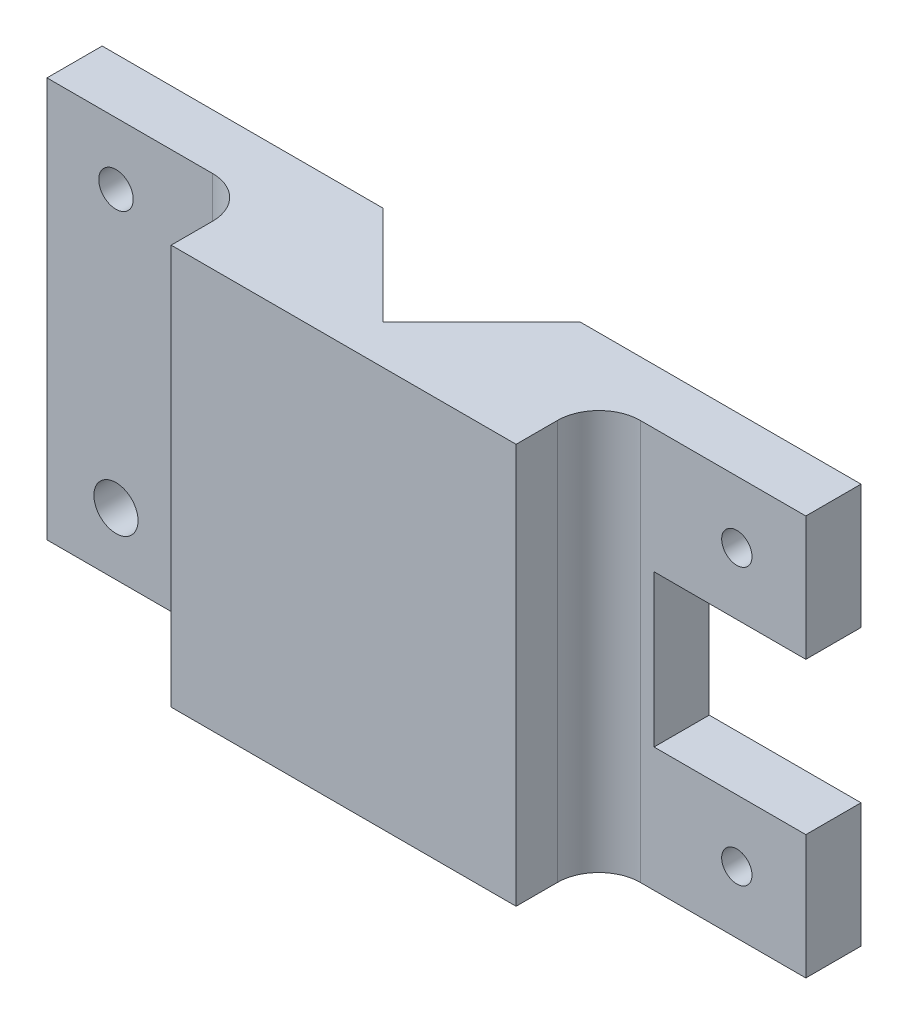
ISO-10303-21;
HEADER;
FILE_DESCRIPTION(('STEP AP214'),'2;1');
FILE_NAME('part.step','',(''),(''),'','','');
FILE_SCHEMA(('AUTOMOTIVE_DESIGN { 1 0 10303 214 1 1 1 1 }'));
ENDSEC;
DATA;
#1=APPLICATION_CONTEXT('core data for automotive mechanical design processes');
#2=APPLICATION_PROTOCOL_DEFINITION('international standard','automotive_design',2000,#1);
#3=PRODUCT_CONTEXT('',#1,'mechanical');
#4=PRODUCT('Part','Part','',(#3));
#5=PRODUCT_RELATED_PRODUCT_CATEGORY('part','',(#4));
#6=PRODUCT_DEFINITION_FORMATION('','',#4);
#7=PRODUCT_DEFINITION_CONTEXT('part definition',#1,'design');
#8=PRODUCT_DEFINITION('design','',#6,#7);
#9=PRODUCT_DEFINITION_SHAPE('','',#8);
#10=(LENGTH_UNIT() NAMED_UNIT(*) SI_UNIT(.MILLI.,.METRE.));
#11=(NAMED_UNIT(*) PLANE_ANGLE_UNIT() SI_UNIT($,.RADIAN.));
#12=(NAMED_UNIT(*) SI_UNIT($,.STERADIAN.) SOLID_ANGLE_UNIT());
#13=UNCERTAINTY_MEASURE_WITH_UNIT(LENGTH_MEASURE(1.E-05),#10,'distance_accuracy_value','');
#14=(GEOMETRIC_REPRESENTATION_CONTEXT(3) GLOBAL_UNCERTAINTY_ASSIGNED_CONTEXT((#13)) GLOBAL_UNIT_ASSIGNED_CONTEXT((#10,
#11,#12)) REPRESENTATION_CONTEXT('',''));
#15=CARTESIAN_POINT('',(0.,0.,0.));
#16=DIRECTION('',(0.,0.,1.));
#17=DIRECTION('',(1.,0.,0.));
#18=AXIS2_PLACEMENT_3D('',#15,#16,#17);
#19=CARTESIAN_POINT('',(27.5,14.5,0.));
#20=DIRECTION('',(-1.,0.,0.));
#21=DIRECTION('',(0.,0.,1.));
#22=AXIS2_PLACEMENT_3D('',#19,#20,#21);
#23=PLANE('',#22);
#24=DIRECTION('',(0.,-1.,0.));
#25=VECTOR('',#24,1.);
#26=CARTESIAN_POINT('',(27.5,14.5,0.));
#27=LINE('',#26,#25);
#28=CARTESIAN_POINT('',(27.5,-5.5,0.));
#29=VERTEX_POINT('',#28);
#30=CARTESIAN_POINT('',(27.5,-14.5,0.));
#31=VERTEX_POINT('',#30);
#32=EDGE_CURVE('E180',#29,#31,#27,.T.);
#33=ORIENTED_EDGE('',*,*,#32,.F.);
#34=DIRECTION('',(0.,0.,1.));
#35=VECTOR('',#34,1.);
#36=CARTESIAN_POINT('',(27.5,-5.5,0.));
#37=LINE('',#36,#35);
#38=CARTESIAN_POINT('',(27.5,-5.5,4.));
#39=VERTEX_POINT('',#38);
#40=EDGE_CURVE('E532',#29,#39,#37,.T.);
#41=ORIENTED_EDGE('',*,*,#40,.T.);
#42=DIRECTION('',(0.,-1.,0.));
#43=VECTOR('',#42,1.);
#44=CARTESIAN_POINT('',(27.5,14.5,4.));
#45=LINE('',#44,#43);
#46=CARTESIAN_POINT('',(27.5,-14.5,4.));
#47=VERTEX_POINT('',#46);
#48=EDGE_CURVE('E179',#39,#47,#45,.T.);
#49=ORIENTED_EDGE('',*,*,#48,.T.);
#50=DIRECTION('',(0.,0.,-1.));
#51=VECTOR('',#50,1.);
#52=CARTESIAN_POINT('',(27.5,-14.5,0.));
#53=LINE('',#52,#51);
#54=EDGE_CURVE('E235',#47,#31,#53,.T.);
#55=ORIENTED_EDGE('',*,*,#54,.T.);
#56=EDGE_LOOP('',(#33,#41,#49,#55));
#57=FACE_BOUND('',#56,.T.);
#58=ADVANCED_FACE('F33',(#57),#23,.F.);
#59=CARTESIAN_POINT('',(-12.5,14.5,4.));
#60=DIRECTION('',(1.,0.,0.));
#61=DIRECTION('',(0.,0.,-1.));
#62=AXIS2_PLACEMENT_3D('',#59,#60,#61);
#63=PLANE('',#62);
#64=DIRECTION('',(0.,0.,1.));
#65=VECTOR('',#64,1.);
#66=CARTESIAN_POINT('',(-12.5,14.5,4.));
#67=LINE('',#66,#65);
#68=CARTESIAN_POINT('',(-12.5,14.5,7.));
#69=VERTEX_POINT('',#68);
#70=CARTESIAN_POINT('',(-12.5,14.5,10.));
#71=VERTEX_POINT('',#70);
#72=EDGE_CURVE('E255',#69,#71,#67,.T.);
#73=ORIENTED_EDGE('',*,*,#72,.F.);
#74=DIRECTION('',(0.,-1.,0.));
#75=VECTOR('',#74,1.);
#76=CARTESIAN_POINT('',(-12.5,-14.5,7.));
#77=LINE('',#76,#75);
#78=CARTESIAN_POINT('',(-12.5,-14.5,7.));
#79=VERTEX_POINT('',#78);
#80=EDGE_CURVE('E199',#69,#79,#77,.T.);
#81=ORIENTED_EDGE('',*,*,#80,.T.);
#82=DIRECTION('',(0.,0.,1.));
#83=VECTOR('',#82,1.);
#84=CARTESIAN_POINT('',(-12.5,-14.5,4.));
#85=LINE('',#84,#83);
#86=CARTESIAN_POINT('',(-12.5,-14.5,10.));
#87=VERTEX_POINT('',#86);
#88=EDGE_CURVE('E237',#79,#87,#85,.T.);
#89=ORIENTED_EDGE('',*,*,#88,.T.);
#90=DIRECTION('',(0.,-1.,0.));
#91=VECTOR('',#90,1.);
#92=CARTESIAN_POINT('',(-12.5,14.5,10.));
#93=LINE('',#92,#91);
#94=EDGE_CURVE('E191',#71,#87,#93,.T.);
#95=ORIENTED_EDGE('',*,*,#94,.F.);
#96=EDGE_LOOP('',(#73,#81,#89,#95));
#97=FACE_BOUND('',#96,.T.);
#98=ADVANCED_FACE('F317',(#97),#63,.F.);
#99=CARTESIAN_POINT('',(12.5,14.5,10.));
#100=DIRECTION('',(0.,0.,-1.));
#101=DIRECTION('',(-1.,0.,0.));
#102=AXIS2_PLACEMENT_3D('',#99,#100,#101);
#103=PLANE('',#102);
#104=DIRECTION('',(1.,0.,0.));
#105=VECTOR('',#104,1.);
#106=CARTESIAN_POINT('',(12.5,-14.5,10.));
#107=LINE('',#106,#105);
#108=CARTESIAN_POINT('',(12.5,-14.5,10.));
#109=VERTEX_POINT('',#108);
#110=EDGE_CURVE('E233',#87,#109,#107,.T.);
#111=ORIENTED_EDGE('',*,*,#110,.T.);
#112=DIRECTION('',(0.,-1.,0.));
#113=VECTOR('',#112,1.);
#114=CARTESIAN_POINT('',(12.5,14.5,10.));
#115=LINE('',#114,#113);
#116=CARTESIAN_POINT('',(12.5,14.5,10.));
#117=VERTEX_POINT('',#116);
#118=EDGE_CURVE('E188',#117,#109,#115,.T.);
#119=ORIENTED_EDGE('',*,*,#118,.F.);
#120=DIRECTION('',(1.,0.,0.));
#121=VECTOR('',#120,1.);
#122=CARTESIAN_POINT('',(12.5,14.5,10.));
#123=LINE('',#122,#121);
#124=EDGE_CURVE('E309',#71,#117,#123,.T.);
#125=ORIENTED_EDGE('',*,*,#124,.F.);
#126=ORIENTED_EDGE('',*,*,#94,.T.);
#127=EDGE_LOOP('',(#111,#119,#125,#126));
#128=FACE_BOUND('',#127,.T.);
#129=ADVANCED_FACE('F316',(#128),#103,.F.);
#130=CARTESIAN_POINT('',(12.5,14.5,4.));
#131=DIRECTION('',(-1.,0.,0.));
#132=DIRECTION('',(0.,0.,1.));
#133=AXIS2_PLACEMENT_3D('',#130,#131,#132);
#134=PLANE('',#133);
#135=DIRECTION('',(0.,0.,-1.));
#136=VECTOR('',#135,1.);
#137=CARTESIAN_POINT('',(12.5,-14.5,4.));
#138=LINE('',#137,#136);
#139=CARTESIAN_POINT('',(12.5,-14.5,7.));
#140=VERTEX_POINT('',#139);
#141=EDGE_CURVE('E227',#109,#140,#138,.T.);
#142=ORIENTED_EDGE('',*,*,#141,.T.);
#143=DIRECTION('',(0.,-1.,0.));
#144=VECTOR('',#143,1.);
#145=CARTESIAN_POINT('',(12.5,14.5,7.));
#146=LINE('',#145,#144);
#147=CARTESIAN_POINT('',(12.5,14.5,7.));
#148=VERTEX_POINT('',#147);
#149=EDGE_CURVE('E197',#140,#148,#146,.F.);
#150=ORIENTED_EDGE('',*,*,#149,.T.);
#151=DIRECTION('',(0.,0.,-1.));
#152=VECTOR('',#151,1.);
#153=CARTESIAN_POINT('',(12.5,14.5,4.));
#154=LINE('',#153,#152);
#155=EDGE_CURVE('E213',#117,#148,#154,.T.);
#156=ORIENTED_EDGE('',*,*,#155,.F.);
#157=ORIENTED_EDGE('',*,*,#118,.T.);
#158=EDGE_LOOP('',(#142,#150,#156,#157));
#159=FACE_BOUND('',#158,.T.);
#160=ADVANCED_FACE('F231',(#159),#134,.F.);
#161=CARTESIAN_POINT('',(27.5,14.5,4.));
#162=DIRECTION('',(0.,0.,-1.));
#163=DIRECTION('',(-1.,0.,0.));
#164=AXIS2_PLACEMENT_3D('',#161,#162,#163);
#165=PLANE('',#164);
#166=CARTESIAN_POINT('',(22.5,-10.,4.));
#167=DIRECTION('',(0.,0.,-1.));
#168=DIRECTION('',(-1.,0.,0.));
#169=AXIS2_PLACEMENT_3D('',#166,#167,#168);
#170=CIRCLE('',#169,1.1);
#171=CARTESIAN_POINT('',(21.4,-10.,4.));
#172=VERTEX_POINT('',#171);
#173=EDGE_CURVE('E295',#172,#172,#170,.T.);
#174=ORIENTED_EDGE('',*,*,#173,.T.);
#175=EDGE_LOOP('',(#174));
#176=FACE_BOUND('',#175,.T.);
#177=CARTESIAN_POINT('',(22.5,10.,4.));
#178=DIRECTION('',(0.,0.,-1.));
#179=DIRECTION('',(-1.,0.,0.));
#180=AXIS2_PLACEMENT_3D('',#177,#178,#179);
#181=CIRCLE('',#180,1.1);
#182=CARTESIAN_POINT('',(21.4,10.,4.));
#183=VERTEX_POINT('',#182);
#184=EDGE_CURVE('E299',#183,#183,#181,.T.);
#185=ORIENTED_EDGE('',*,*,#184,.T.);
#186=EDGE_LOOP('',(#185));
#187=FACE_BOUND('',#186,.T.);
#188=DIRECTION('',(1.,0.,0.));
#189=VECTOR('',#188,1.);
#190=CARTESIAN_POINT('',(27.5,14.5,4.));
#191=LINE('',#190,#189);
#192=CARTESIAN_POINT('',(15.5,14.5,4.));
#193=VERTEX_POINT('',#192);
#194=CARTESIAN_POINT('',(27.5,14.5,4.));
#195=VERTEX_POINT('',#194);
#196=EDGE_CURVE('E211',#193,#195,#191,.T.);
#197=ORIENTED_EDGE('',*,*,#196,.F.);
#198=DIRECTION('',(0.,-1.,0.));
#199=VECTOR('',#198,1.);
#200=CARTESIAN_POINT('',(15.5,-14.5,4.));
#201=LINE('',#200,#199);
#202=CARTESIAN_POINT('',(15.5,-14.5,4.));
#203=VERTEX_POINT('',#202);
#204=EDGE_CURVE('E194',#193,#203,#201,.T.);
#205=ORIENTED_EDGE('',*,*,#204,.T.);
#206=DIRECTION('',(1.,0.,0.));
#207=VECTOR('',#206,1.);
#208=CARTESIAN_POINT('',(27.5,-14.5,4.));
#209=LINE('',#208,#207);
#210=EDGE_CURVE('E229',#203,#47,#209,.T.);
#211=ORIENTED_EDGE('',*,*,#210,.T.);
#212=ORIENTED_EDGE('',*,*,#48,.F.);
#213=DIRECTION('',(-1.,0.,0.));
#214=VECTOR('',#213,1.);
#215=CARTESIAN_POINT('',(27.5,-5.5,4.));
#216=LINE('',#215,#214);
#217=CARTESIAN_POINT('',(16.5,-5.5,4.));
#218=VERTEX_POINT('',#217);
#219=EDGE_CURVE('E304',#39,#218,#216,.T.);
#220=ORIENTED_EDGE('',*,*,#219,.T.);
#221=DIRECTION('',(0.,1.,0.));
#222=VECTOR('',#221,1.);
#223=CARTESIAN_POINT('',(16.5,14.5,4.));
#224=LINE('',#223,#222);
#225=CARTESIAN_POINT('',(16.5,5.5,4.));
#226=VERTEX_POINT('',#225);
#227=EDGE_CURVE('E530',#218,#226,#224,.T.);
#228=ORIENTED_EDGE('',*,*,#227,.T.);
#229=DIRECTION('',(1.,0.,0.));
#230=VECTOR('',#229,1.);
#231=CARTESIAN_POINT('',(27.5,5.5,4.));
#232=LINE('',#231,#230);
#233=CARTESIAN_POINT('',(27.5,5.5,4.));
#234=VERTEX_POINT('',#233);
#235=EDGE_CURVE('E540',#226,#234,#232,.T.);
#236=ORIENTED_EDGE('',*,*,#235,.T.);
#237=EDGE_CURVE('E173',#195,#234,#45,.T.);
#238=ORIENTED_EDGE('',*,*,#237,.F.);
#239=EDGE_LOOP('',(#197,#205,#211,#212,#220,#228,#236,#238));
#240=FACE_BOUND('',#239,.T.);
#241=ADVANCED_FACE('F218',(#176,#187,#240),#165,.F.);
#242=ORIENTED_EDGE('',*,*,#237,.T.);
#243=DIRECTION('',(0.,0.,1.));
#244=VECTOR('',#243,1.);
#245=CARTESIAN_POINT('',(27.5,5.5,0.));
#246=LINE('',#245,#244);
#247=CARTESIAN_POINT('',(27.5,5.5,0.));
#248=VERTEX_POINT('',#247);
#249=EDGE_CURVE('E155',#248,#234,#246,.T.);
#250=ORIENTED_EDGE('',*,*,#249,.F.);
#251=CARTESIAN_POINT('',(27.5,14.5,0.));
#252=VERTEX_POINT('',#251);
#253=EDGE_CURVE('E170',#252,#248,#27,.T.);
#254=ORIENTED_EDGE('',*,*,#253,.F.);
#255=DIRECTION('',(0.,0.,-1.));
#256=VECTOR('',#255,1.);
#257=CARTESIAN_POINT('',(27.5,14.5,0.));
#258=LINE('',#257,#256);
#259=EDGE_CURVE('E220',#195,#252,#258,.T.);
#260=ORIENTED_EDGE('',*,*,#259,.F.);
#261=EDGE_LOOP('',(#242,#250,#254,#260));
#262=FACE_BOUND('',#261,.T.);
#263=ADVANCED_FACE('F168',(#262),#23,.F.);
#264=CARTESIAN_POINT('',(7.1317279836453,14.5,0.));
#265=DIRECTION('',(0.,0.,1.));
#266=DIRECTION('',(1.,0.,0.));
#267=AXIS2_PLACEMENT_3D('',#264,#265,#266);
#268=PLANE('',#267);
#269=CARTESIAN_POINT('',(22.5,-10.,0.));
#270=DIRECTION('',(0.,0.,1.));
#271=DIRECTION('',(1.,0.,0.));
#272=AXIS2_PLACEMENT_3D('',#269,#270,#271);
#273=CIRCLE('',#272,1.1);
#274=CARTESIAN_POINT('',(23.6,-10.,0.));
#275=VERTEX_POINT('',#274);
#276=EDGE_CURVE('E545',#275,#275,#273,.T.);
#277=ORIENTED_EDGE('',*,*,#276,.T.);
#278=EDGE_LOOP('',(#277));
#279=FACE_BOUND('',#278,.T.);
#280=CARTESIAN_POINT('',(22.5,10.,0.));
#281=DIRECTION('',(0.,0.,1.));
#282=DIRECTION('',(1.,0.,0.));
#283=AXIS2_PLACEMENT_3D('',#280,#281,#282);
#284=CIRCLE('',#283,1.1);
#285=CARTESIAN_POINT('',(23.6,10.,0.));
#286=VERTEX_POINT('',#285);
#287=EDGE_CURVE('E163',#286,#286,#284,.T.);
#288=ORIENTED_EDGE('',*,*,#287,.T.);
#289=EDGE_LOOP('',(#288));
#290=FACE_BOUND('',#289,.T.);
#291=DIRECTION('',(0.,-1.,0.));
#292=VECTOR('',#291,1.);
#293=CARTESIAN_POINT('',(16.5,5.5,0.));
#294=LINE('',#293,#292);
#295=CARTESIAN_POINT('',(16.5,5.5,0.));
#296=VERTEX_POINT('',#295);
#297=CARTESIAN_POINT('',(16.5,-5.5,0.));
#298=VERTEX_POINT('',#297);
#299=EDGE_CURVE('E162',#296,#298,#294,.T.);
#300=ORIENTED_EDGE('',*,*,#299,.T.);
#301=DIRECTION('',(1.,0.,0.));
#302=VECTOR('',#301,1.);
#303=CARTESIAN_POINT('',(16.5,-5.5,0.));
#304=LINE('',#303,#302);
#305=EDGE_CURVE('E174',#298,#29,#304,.T.);
#306=ORIENTED_EDGE('',*,*,#305,.T.);
#307=ORIENTED_EDGE('',*,*,#32,.T.);
#308=DIRECTION('',(-1.,0.,0.));
#309=VECTOR('',#308,1.);
#310=CARTESIAN_POINT('',(7.1317279836453,-14.5,0.));
#311=LINE('',#310,#309);
#312=CARTESIAN_POINT('',(7.1317279836453,-14.5,0.));
#313=VERTEX_POINT('',#312);
#314=EDGE_CURVE('E243',#31,#313,#311,.T.);
#315=ORIENTED_EDGE('',*,*,#314,.T.);
#316=DIRECTION('',(0.,-1.,0.));
#317=VECTOR('',#316,1.);
#318=CARTESIAN_POINT('',(7.1317279836453,14.5,0.));
#319=LINE('',#318,#317);
#320=CARTESIAN_POINT('',(7.1317279836453,14.5,0.));
#321=VERTEX_POINT('',#320);
#322=EDGE_CURVE('E184',#321,#313,#319,.T.);
#323=ORIENTED_EDGE('',*,*,#322,.F.);
#324=DIRECTION('',(-1.,0.,0.));
#325=VECTOR('',#324,1.);
#326=CARTESIAN_POINT('',(7.1317279836453,14.5,0.));
#327=LINE('',#326,#325);
#328=EDGE_CURVE('E178',#252,#321,#327,.T.);
#329=ORIENTED_EDGE('',*,*,#328,.F.);
#330=ORIENTED_EDGE('',*,*,#253,.T.);
#331=DIRECTION('',(-1.,0.,0.));
#332=VECTOR('',#331,1.);
#333=CARTESIAN_POINT('',(27.5,5.5,0.));
#334=LINE('',#333,#332);
#335=EDGE_CURVE('E152',#248,#296,#334,.T.);
#336=ORIENTED_EDGE('',*,*,#335,.T.);
#337=EDGE_LOOP('',(#300,#306,#307,#315,#323,#329,#330,#336));
#338=FACE_BOUND('',#337,.T.);
#339=ADVANCED_FACE('F176',(#279,#290,#338),#268,.F.);
#340=CARTESIAN_POINT('',(0.,14.5,7.1317279836453));
#341=DIRECTION('',(0.707106781186547,0.,0.707106781186548));
#342=DIRECTION('',(0.707106781186548,0.,-0.707106781186547));
#343=AXIS2_PLACEMENT_3D('',#340,#341,#342);
#344=PLANE('',#343);
#345=DIRECTION('',(-0.707106781186548,0.,0.707106781186547));
#346=VECTOR('',#345,1.);
#347=CARTESIAN_POINT('',(0.,-14.5,7.1317279836453));
#348=LINE('',#347,#346);
#349=CARTESIAN_POINT('',(0.,-14.5,7.1317279836453));
#350=VERTEX_POINT('',#349);
#351=EDGE_CURVE('E245',#313,#350,#348,.T.);
#352=ORIENTED_EDGE('',*,*,#351,.T.);
#353=DIRECTION('',(0.,-1.,0.));
#354=VECTOR('',#353,1.);
#355=CARTESIAN_POINT('',(0.,14.5,7.1317279836453));
#356=LINE('',#355,#354);
#357=CARTESIAN_POINT('',(0.,14.5,7.1317279836453));
#358=VERTEX_POINT('',#357);
#359=EDGE_CURVE('E265',#358,#350,#356,.T.);
#360=ORIENTED_EDGE('',*,*,#359,.F.);
#361=DIRECTION('',(-0.707106781186548,0.,0.707106781186547));
#362=VECTOR('',#361,1.);
#363=CARTESIAN_POINT('',(0.,14.5,7.1317279836453));
#364=LINE('',#363,#362);
#365=EDGE_CURVE('E276',#321,#358,#364,.T.);
#366=ORIENTED_EDGE('',*,*,#365,.F.);
#367=ORIENTED_EDGE('',*,*,#322,.T.);
#368=EDGE_LOOP('',(#352,#360,#366,#367));
#369=FACE_BOUND('',#368,.T.);
#370=ADVANCED_FACE('F275',(#369),#344,.F.);
#371=CARTESIAN_POINT('',(-7.1317279836453,14.5,0.));
#372=DIRECTION('',(-0.707106781186547,0.,0.707106781186548));
#373=DIRECTION('',(0.707106781186548,0.,0.707106781186547));
#374=AXIS2_PLACEMENT_3D('',#371,#372,#373);
#375=PLANE('',#374);
#376=DIRECTION('',(-0.707106781186548,0.,-0.707106781186547));
#377=VECTOR('',#376,1.);
#378=CARTESIAN_POINT('',(-7.1317279836453,-14.5,0.));
#379=LINE('',#378,#377);
#380=CARTESIAN_POINT('',(-7.1317279836453,-14.5,0.));
#381=VERTEX_POINT('',#380);
#382=EDGE_CURVE('E247',#350,#381,#379,.T.);
#383=ORIENTED_EDGE('',*,*,#382,.T.);
#384=DIRECTION('',(0.,-1.,0.));
#385=VECTOR('',#384,1.);
#386=CARTESIAN_POINT('',(-7.1317279836453,14.5,0.));
#387=LINE('',#386,#385);
#388=CARTESIAN_POINT('',(-7.1317279836453,14.5,0.));
#389=VERTEX_POINT('',#388);
#390=EDGE_CURVE('E263',#389,#381,#387,.T.);
#391=ORIENTED_EDGE('',*,*,#390,.F.);
#392=DIRECTION('',(-0.707106781186548,0.,-0.707106781186547));
#393=VECTOR('',#392,1.);
#394=CARTESIAN_POINT('',(-7.1317279836453,14.5,0.));
#395=LINE('',#394,#393);
#396=EDGE_CURVE('E289',#358,#389,#395,.T.);
#397=ORIENTED_EDGE('',*,*,#396,.F.);
#398=ORIENTED_EDGE('',*,*,#359,.T.);
#399=EDGE_LOOP('',(#383,#391,#397,#398));
#400=FACE_BOUND('',#399,.T.);
#401=ADVANCED_FACE('F281',(#400),#375,.F.);
#402=CARTESIAN_POINT('',(-7.1317279836453,14.5,0.));
#403=DIRECTION('',(0.,0.,1.));
#404=DIRECTION('',(1.,0.,0.));
#405=AXIS2_PLACEMENT_3D('',#402,#403,#404);
#406=PLANE('',#405);
#407=CARTESIAN_POINT('',(-22.5,10.,0.));
#408=DIRECTION('',(0.,0.,1.));
#409=DIRECTION('',(1.,0.,0.));
#410=AXIS2_PLACEMENT_3D('',#407,#408,#409);
#411=CIRCLE('',#410,1.25);
#412=CARTESIAN_POINT('',(-21.25,10.,0.));
#413=VERTEX_POINT('',#412);
#414=EDGE_CURVE('E548',#413,#413,#411,.T.);
#415=ORIENTED_EDGE('',*,*,#414,.T.);
#416=EDGE_LOOP('',(#415));
#417=FACE_BOUND('',#416,.T.);
#418=CARTESIAN_POINT('',(-22.5,-10.,0.));
#419=DIRECTION('',(0.,0.,1.));
#420=DIRECTION('',(1.,0.,0.));
#421=AXIS2_PLACEMENT_3D('',#418,#419,#420);
#422=CIRCLE('',#421,1.6);
#423=CARTESIAN_POINT('',(-20.9,-10.,0.));
#424=VERTEX_POINT('',#423);
#425=EDGE_CURVE('E554',#424,#424,#422,.T.);
#426=ORIENTED_EDGE('',*,*,#425,.T.);
#427=EDGE_LOOP('',(#426));
#428=FACE_BOUND('',#427,.T.);
#429=DIRECTION('',(-1.,0.,0.));
#430=VECTOR('',#429,1.);
#431=CARTESIAN_POINT('',(-7.1317279836453,-14.5,0.));
#432=LINE('',#431,#430);
#433=CARTESIAN_POINT('',(-27.5,-14.5,0.));
#434=VERTEX_POINT('',#433);
#435=EDGE_CURVE('E249',#381,#434,#432,.T.);
#436=ORIENTED_EDGE('',*,*,#435,.T.);
#437=DIRECTION('',(0.,-1.,0.));
#438=VECTOR('',#437,1.);
#439=CARTESIAN_POINT('',(-27.5,14.5,0.));
#440=LINE('',#439,#438);
#441=CARTESIAN_POINT('',(-27.5,14.5,0.));
#442=VERTEX_POINT('',#441);
#443=EDGE_CURVE('E259',#442,#434,#440,.T.);
#444=ORIENTED_EDGE('',*,*,#443,.F.);
#445=DIRECTION('',(-1.,0.,0.));
#446=VECTOR('',#445,1.);
#447=CARTESIAN_POINT('',(-7.1317279836453,14.5,0.));
#448=LINE('',#447,#446);
#449=EDGE_CURVE('E286',#389,#442,#448,.T.);
#450=ORIENTED_EDGE('',*,*,#449,.F.);
#451=ORIENTED_EDGE('',*,*,#390,.T.);
#452=EDGE_LOOP('',(#436,#444,#450,#451));
#453=FACE_BOUND('',#452,.T.);
#454=ADVANCED_FACE('F284',(#417,#428,#453),#406,.F.);
#455=CARTESIAN_POINT('',(-27.5,14.5,0.));
#456=DIRECTION('',(1.,0.,0.));
#457=DIRECTION('',(0.,0.,-1.));
#458=AXIS2_PLACEMENT_3D('',#455,#456,#457);
#459=PLANE('',#458);
#460=DIRECTION('',(0.,0.,1.));
#461=VECTOR('',#460,1.);
#462=CARTESIAN_POINT('',(-27.5,-14.5,0.));
#463=LINE('',#462,#461);
#464=CARTESIAN_POINT('',(-27.5,-14.5,4.));
#465=VERTEX_POINT('',#464);
#466=EDGE_CURVE('E251',#434,#465,#463,.T.);
#467=ORIENTED_EDGE('',*,*,#466,.T.);
#468=DIRECTION('',(0.,-1.,0.));
#469=VECTOR('',#468,1.);
#470=CARTESIAN_POINT('',(-27.5,14.5,4.));
#471=LINE('',#470,#469);
#472=CARTESIAN_POINT('',(-27.5,14.5,4.));
#473=VERTEX_POINT('',#472);
#474=EDGE_CURVE('E256',#473,#465,#471,.T.);
#475=ORIENTED_EDGE('',*,*,#474,.F.);
#476=DIRECTION('',(0.,0.,1.));
#477=VECTOR('',#476,1.);
#478=CARTESIAN_POINT('',(-27.5,14.5,0.));
#479=LINE('',#478,#477);
#480=EDGE_CURVE('E288',#442,#473,#479,.T.);
#481=ORIENTED_EDGE('',*,*,#480,.F.);
#482=ORIENTED_EDGE('',*,*,#443,.T.);
#483=EDGE_LOOP('',(#467,#475,#481,#482));
#484=FACE_BOUND('',#483,.T.);
#485=ADVANCED_FACE('F324',(#484),#459,.F.);
#486=CARTESIAN_POINT('',(-27.5,14.5,4.));
#487=DIRECTION('',(0.,0.,-1.));
#488=DIRECTION('',(-1.,0.,0.));
#489=AXIS2_PLACEMENT_3D('',#486,#487,#488);
#490=PLANE('',#489);
#491=CARTESIAN_POINT('',(-22.5,10.,4.));
#492=DIRECTION('',(0.,0.,1.));
#493=DIRECTION('',(1.,0.,0.));
#494=AXIS2_PLACEMENT_3D('',#491,#492,#493);
#495=CIRCLE('',#494,1.25);
#496=CARTESIAN_POINT('',(-21.25,10.,4.));
#497=VERTEX_POINT('',#496);
#498=EDGE_CURVE('E557',#497,#497,#495,.T.);
#499=ORIENTED_EDGE('',*,*,#498,.F.);
#500=EDGE_LOOP('',(#499));
#501=FACE_BOUND('',#500,.T.);
#502=CARTESIAN_POINT('',(-22.5,-10.,4.));
#503=DIRECTION('',(0.,0.,1.));
#504=DIRECTION('',(1.,0.,0.));
#505=AXIS2_PLACEMENT_3D('',#502,#503,#504);
#506=CIRCLE('',#505,1.6);
#507=CARTESIAN_POINT('',(-20.9,-10.,4.));
#508=VERTEX_POINT('',#507);
#509=EDGE_CURVE('E551',#508,#508,#506,.T.);
#510=ORIENTED_EDGE('',*,*,#509,.F.);
#511=EDGE_LOOP('',(#510));
#512=FACE_BOUND('',#511,.T.);
#513=DIRECTION('',(1.,0.,0.));
#514=VECTOR('',#513,1.);
#515=CARTESIAN_POINT('',(-27.5,-14.5,4.));
#516=LINE('',#515,#514);
#517=CARTESIAN_POINT('',(-15.5,-14.5,4.));
#518=VERTEX_POINT('',#517);
#519=EDGE_CURVE('E253',#465,#518,#516,.T.);
#520=ORIENTED_EDGE('',*,*,#519,.T.);
#521=DIRECTION('',(0.,-1.,0.));
#522=VECTOR('',#521,1.);
#523=CARTESIAN_POINT('',(-15.5,14.5,4.));
#524=LINE('',#523,#522);
#525=CARTESIAN_POINT('',(-15.5,14.5,4.));
#526=VERTEX_POINT('',#525);
#527=EDGE_CURVE('E48',#518,#526,#524,.F.);
#528=ORIENTED_EDGE('',*,*,#527,.T.);
#529=DIRECTION('',(1.,0.,0.));
#530=VECTOR('',#529,1.);
#531=CARTESIAN_POINT('',(-27.5,14.5,4.));
#532=LINE('',#531,#530);
#533=EDGE_CURVE('E260',#473,#526,#532,.T.);
#534=ORIENTED_EDGE('',*,*,#533,.F.);
#535=ORIENTED_EDGE('',*,*,#474,.T.);
#536=EDGE_LOOP('',(#520,#528,#534,#535));
#537=FACE_BOUND('',#536,.T.);
#538=ADVANCED_FACE('F322',(#501,#512,#537),#490,.F.);
#539=CARTESIAN_POINT('',(0.,14.5,0.));
#540=DIRECTION('',(0.,-1.,0.));
#541=DIRECTION('',(0.,0.,-1.));
#542=AXIS2_PLACEMENT_3D('',#539,#540,#541);
#543=PLANE('',#542);
#544=ORIENTED_EDGE('',*,*,#533,.T.);
#545=CARTESIAN_POINT('',(-15.5,14.5,7.));
#546=DIRECTION('',(0.,-1.,0.));
#547=DIRECTION('',(0.,0.,-1.));
#548=AXIS2_PLACEMENT_3D('',#545,#546,#547);
#549=CIRCLE('',#548,3.);
#550=EDGE_CURVE('E11',#526,#69,#549,.T.);
#551=ORIENTED_EDGE('',*,*,#550,.T.);
#552=ORIENTED_EDGE('',*,*,#72,.T.);
#553=ORIENTED_EDGE('',*,*,#124,.T.);
#554=ORIENTED_EDGE('',*,*,#155,.T.);
#555=CARTESIAN_POINT('',(15.5,14.5,7.));
#556=DIRECTION('',(0.,-1.,0.));
#557=DIRECTION('',(0.,0.,-1.));
#558=AXIS2_PLACEMENT_3D('',#555,#556,#557);
#559=CIRCLE('',#558,3.);
#560=EDGE_CURVE('E205',#148,#193,#559,.T.);
#561=ORIENTED_EDGE('',*,*,#560,.T.);
#562=ORIENTED_EDGE('',*,*,#196,.T.);
#563=ORIENTED_EDGE('',*,*,#259,.T.);
#564=ORIENTED_EDGE('',*,*,#328,.T.);
#565=ORIENTED_EDGE('',*,*,#365,.T.);
#566=ORIENTED_EDGE('',*,*,#396,.T.);
#567=ORIENTED_EDGE('',*,*,#449,.T.);
#568=ORIENTED_EDGE('',*,*,#480,.T.);
#569=EDGE_LOOP('',(#544,#551,#552,#553,#554,#561,#562,#563,#564,#565,#566,#567,#568));
#570=FACE_BOUND('',#569,.T.);
#571=ADVANCED_FACE('F210',(#570),#543,.F.);
#572=CARTESIAN_POINT('',(0.,-14.5,0.));
#573=DIRECTION('',(0.,-1.,0.));
#574=DIRECTION('',(0.,0.,-1.));
#575=AXIS2_PLACEMENT_3D('',#572,#573,#574);
#576=PLANE('',#575);
#577=ORIENTED_EDGE('',*,*,#88,.F.);
#578=CARTESIAN_POINT('',(-15.5,-14.5,7.));
#579=DIRECTION('',(0.,-1.,0.));
#580=DIRECTION('',(0.,0.,-1.));
#581=AXIS2_PLACEMENT_3D('',#578,#579,#580);
#582=CIRCLE('',#581,3.);
#583=EDGE_CURVE('E41',#79,#518,#582,.F.);
#584=ORIENTED_EDGE('',*,*,#583,.T.);
#585=ORIENTED_EDGE('',*,*,#519,.F.);
#586=ORIENTED_EDGE('',*,*,#466,.F.);
#587=ORIENTED_EDGE('',*,*,#435,.F.);
#588=ORIENTED_EDGE('',*,*,#382,.F.);
#589=ORIENTED_EDGE('',*,*,#351,.F.);
#590=ORIENTED_EDGE('',*,*,#314,.F.);
#591=ORIENTED_EDGE('',*,*,#54,.F.);
#592=ORIENTED_EDGE('',*,*,#210,.F.);
#593=CARTESIAN_POINT('',(15.5,-14.5,7.));
#594=DIRECTION('',(0.,-1.,0.));
#595=DIRECTION('',(0.,0.,-1.));
#596=AXIS2_PLACEMENT_3D('',#593,#594,#595);
#597=CIRCLE('',#596,3.);
#598=EDGE_CURVE('E203',#203,#140,#597,.F.);
#599=ORIENTED_EDGE('',*,*,#598,.T.);
#600=ORIENTED_EDGE('',*,*,#141,.F.);
#601=ORIENTED_EDGE('',*,*,#110,.F.);
#602=EDGE_LOOP('',(#577,#584,#585,#586,#587,#588,#589,#590,#591,#592,#599,#600,#601));
#603=FACE_BOUND('',#602,.T.);
#604=ADVANCED_FACE('F225',(#603),#576,.T.);
#605=CARTESIAN_POINT('',(16.5,-5.5,0.));
#606=DIRECTION('',(0.,-1.,0.));
#607=DIRECTION('',(0.,0.,-1.));
#608=AXIS2_PLACEMENT_3D('',#605,#606,#607);
#609=PLANE('',#608);
#610=ORIENTED_EDGE('',*,*,#40,.F.);
#611=ORIENTED_EDGE('',*,*,#305,.F.);
#612=DIRECTION('',(0.,0.,1.));
#613=VECTOR('',#612,1.);
#614=CARTESIAN_POINT('',(16.5,-5.5,0.));
#615=LINE('',#614,#613);
#616=EDGE_CURVE('E527',#298,#218,#615,.T.);
#617=ORIENTED_EDGE('',*,*,#616,.T.);
#618=ORIENTED_EDGE('',*,*,#219,.F.);
#619=EDGE_LOOP('',(#610,#611,#617,#618));
#620=FACE_BOUND('',#619,.T.);
#621=ADVANCED_FACE('F383',(#620),#609,.F.);
#622=CARTESIAN_POINT('',(16.5,5.5,0.));
#623=DIRECTION('',(-1.,0.,0.));
#624=DIRECTION('',(0.,0.,1.));
#625=AXIS2_PLACEMENT_3D('',#622,#623,#624);
#626=PLANE('',#625);
#627=ORIENTED_EDGE('',*,*,#616,.F.);
#628=ORIENTED_EDGE('',*,*,#299,.F.);
#629=DIRECTION('',(0.,0.,1.));
#630=VECTOR('',#629,1.);
#631=CARTESIAN_POINT('',(16.5,5.5,0.));
#632=LINE('',#631,#630);
#633=EDGE_CURVE('E158',#296,#226,#632,.T.);
#634=ORIENTED_EDGE('',*,*,#633,.T.);
#635=ORIENTED_EDGE('',*,*,#227,.F.);
#636=EDGE_LOOP('',(#627,#628,#634,#635));
#637=FACE_BOUND('',#636,.T.);
#638=ADVANCED_FACE('F386',(#637),#626,.F.);
#639=CARTESIAN_POINT('',(27.5,5.5,0.));
#640=DIRECTION('',(0.,1.,0.));
#641=DIRECTION('',(-1.,0.,0.));
#642=AXIS2_PLACEMENT_3D('',#639,#640,#641);
#643=PLANE('',#642);
#644=ORIENTED_EDGE('',*,*,#633,.F.);
#645=ORIENTED_EDGE('',*,*,#335,.F.);
#646=ORIENTED_EDGE('',*,*,#249,.T.);
#647=ORIENTED_EDGE('',*,*,#235,.F.);
#648=EDGE_LOOP('',(#644,#645,#646,#647));
#649=FACE_BOUND('',#648,.T.);
#650=ADVANCED_FACE('F154',(#649),#643,.F.);
#651=CARTESIAN_POINT('',(22.5,10.,0.));
#652=DIRECTION('',(0.,0.,1.));
#653=DIRECTION('',(1.,0.,0.));
#654=AXIS2_PLACEMENT_3D('',#651,#652,#653);
#655=CYLINDRICAL_SURFACE('',#654,1.1);
#656=ORIENTED_EDGE('',*,*,#287,.F.);
#657=EDGE_LOOP('',(#656));
#658=FACE_BOUND('',#657,.T.);
#659=ORIENTED_EDGE('',*,*,#184,.F.);
#660=EDGE_LOOP('',(#659));
#661=FACE_BOUND('',#660,.T.);
#662=ADVANCED_FACE('F376',(#658,#661),#655,.F.);
#663=CARTESIAN_POINT('',(22.5,-10.,0.));
#664=DIRECTION('',(0.,0.,1.));
#665=DIRECTION('',(1.,0.,0.));
#666=AXIS2_PLACEMENT_3D('',#663,#664,#665);
#667=CYLINDRICAL_SURFACE('',#666,1.1);
#668=ORIENTED_EDGE('',*,*,#276,.F.);
#669=EDGE_LOOP('',(#668));
#670=FACE_BOUND('',#669,.T.);
#671=ORIENTED_EDGE('',*,*,#173,.F.);
#672=EDGE_LOOP('',(#671));
#673=FACE_BOUND('',#672,.T.);
#674=ADVANCED_FACE('F370',(#670,#673),#667,.F.);
#675=CARTESIAN_POINT('',(-22.5,-10.,0.));
#676=DIRECTION('',(0.,0.,1.));
#677=DIRECTION('',(1.,0.,0.));
#678=AXIS2_PLACEMENT_3D('',#675,#676,#677);
#679=CYLINDRICAL_SURFACE('',#678,1.6);
#680=ORIENTED_EDGE('',*,*,#425,.F.);
#681=EDGE_LOOP('',(#680));
#682=FACE_BOUND('',#681,.T.);
#683=ORIENTED_EDGE('',*,*,#509,.T.);
#684=EDGE_LOOP('',(#683));
#685=FACE_BOUND('',#684,.T.);
#686=ADVANCED_FACE('F364',(#682,#685),#679,.F.);
#687=CARTESIAN_POINT('',(-22.5,10.,0.));
#688=DIRECTION('',(0.,0.,1.));
#689=DIRECTION('',(1.,0.,0.));
#690=AXIS2_PLACEMENT_3D('',#687,#688,#689);
#691=CYLINDRICAL_SURFACE('',#690,1.25);
#692=ORIENTED_EDGE('',*,*,#414,.F.);
#693=EDGE_LOOP('',(#692));
#694=FACE_BOUND('',#693,.T.);
#695=ORIENTED_EDGE('',*,*,#498,.T.);
#696=EDGE_LOOP('',(#695));
#697=FACE_BOUND('',#696,.T.);
#698=ADVANCED_FACE('F359',(#694,#697),#691,.F.);
#699=CARTESIAN_POINT('',(15.5,14.5,7.));
#700=DIRECTION('',(0.,1.,0.));
#701=DIRECTION('',(0.,0.,1.));
#702=AXIS2_PLACEMENT_3D('',#699,#700,#701);
#703=CYLINDRICAL_SURFACE('',#702,3.);
#704=ORIENTED_EDGE('',*,*,#560,.F.);
#705=ORIENTED_EDGE('',*,*,#149,.F.);
#706=ORIENTED_EDGE('',*,*,#598,.F.);
#707=ORIENTED_EDGE('',*,*,#204,.F.);
#708=EDGE_LOOP('',(#704,#705,#706,#707));
#709=FACE_BOUND('',#708,.T.);
#710=ADVANCED_FACE('F222',(#709),#703,.F.);
#711=CARTESIAN_POINT('',(-15.5,14.5,7.));
#712=DIRECTION('',(0.,1.,0.));
#713=DIRECTION('',(0.,0.,1.));
#714=AXIS2_PLACEMENT_3D('',#711,#712,#713);
#715=CYLINDRICAL_SURFACE('',#714,3.);
#716=ORIENTED_EDGE('',*,*,#550,.F.);
#717=ORIENTED_EDGE('',*,*,#527,.F.);
#718=ORIENTED_EDGE('',*,*,#583,.F.);
#719=ORIENTED_EDGE('',*,*,#80,.F.);
#720=EDGE_LOOP('',(#716,#717,#718,#719));
#721=FACE_BOUND('',#720,.T.);
#722=ADVANCED_FACE('F35',(#721),#715,.F.);
#723=CLOSED_SHELL('',(#58,#98,#129,#160,#241,#263,#339,#370,#401,#454,#485,#538,#571,#604,#621,
#638,#650,#662,#674,#686,#698,#710,#722));
#724=MANIFOLD_SOLID_BREP('B2',#723);
#725=ADVANCED_BREP_SHAPE_REPRESENTATION('',(#18,#724),#14);
#726=SHAPE_DEFINITION_REPRESENTATION(#9,#725);
ENDSEC;
END-ISO-10303-21;
